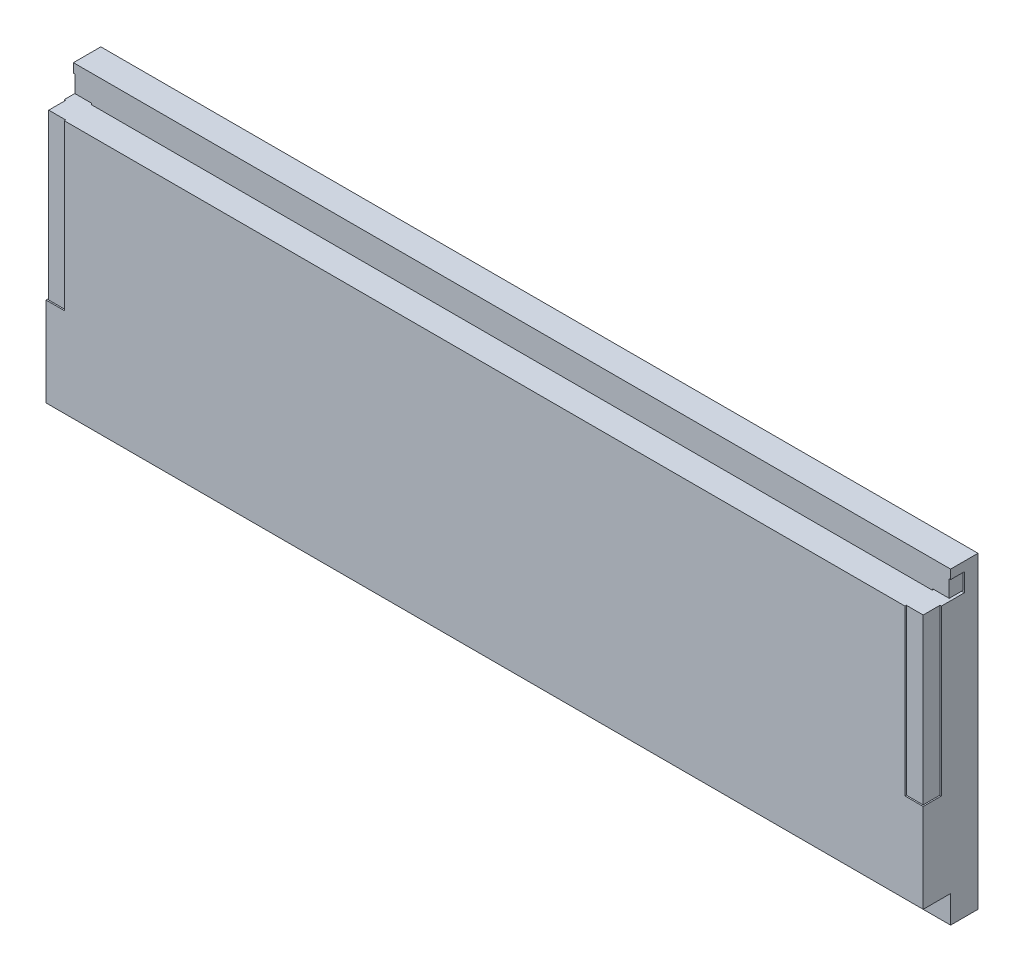
ISO-10303-21;
HEADER;
FILE_DESCRIPTION(('STEP AP214'),'2;1');
FILE_NAME('part.step','',(''),(''),'','','');
FILE_SCHEMA(('AUTOMOTIVE_DESIGN { 1 0 10303 214 1 1 1 1 }'));
ENDSEC;
DATA;
#1=APPLICATION_CONTEXT('core data for automotive mechanical design processes');
#2=APPLICATION_PROTOCOL_DEFINITION('international standard','automotive_design',2000,#1);
#3=PRODUCT_CONTEXT('',#1,'mechanical');
#4=PRODUCT('Part','Part','',(#3));
#5=PRODUCT_RELATED_PRODUCT_CATEGORY('part','',(#4));
#6=PRODUCT_DEFINITION_FORMATION('','',#4);
#7=PRODUCT_DEFINITION_CONTEXT('part definition',#1,'design');
#8=PRODUCT_DEFINITION('design','',#6,#7);
#9=PRODUCT_DEFINITION_SHAPE('','',#8);
#10=(LENGTH_UNIT() NAMED_UNIT(*) SI_UNIT(.MILLI.,.METRE.));
#11=(NAMED_UNIT(*) PLANE_ANGLE_UNIT() SI_UNIT($,.RADIAN.));
#12=(NAMED_UNIT(*) SI_UNIT($,.STERADIAN.) SOLID_ANGLE_UNIT());
#13=UNCERTAINTY_MEASURE_WITH_UNIT(LENGTH_MEASURE(1.E-05),#10,'distance_accuracy_value','');
#14=(GEOMETRIC_REPRESENTATION_CONTEXT(3) GLOBAL_UNCERTAINTY_ASSIGNED_CONTEXT((#13)) GLOBAL_UNIT_ASSIGNED_CONTEXT((#10,
#11,#12)) REPRESENTATION_CONTEXT('',''));
#15=CARTESIAN_POINT('',(0.,0.,0.));
#16=DIRECTION('',(0.,0.,1.));
#17=DIRECTION('',(1.,0.,0.));
#18=AXIS2_PLACEMENT_3D('',#15,#16,#17);
#19=CARTESIAN_POINT('',(960.,337.5,120.));
#20=DIRECTION('',(-1.,0.,0.));
#21=DIRECTION('',(0.,-1.,0.));
#22=AXIS2_PLACEMENT_3D('',#19,#20,#21);
#23=PLANE('',#22);
#24=DIRECTION('',(0.,-1.,0.));
#25=VECTOR('',#24,1.);
#26=CARTESIAN_POINT('',(960.,317.499999999999,30.));
#27=LINE('',#26,#25);
#28=CARTESIAN_POINT('',(960.,317.499999999999,30.));
#29=VERTEX_POINT('',#28);
#30=CARTESIAN_POINT('',(960.,277.499999999999,30.));
#31=VERTEX_POINT('',#30);
#32=EDGE_CURVE('E231',#29,#31,#27,.T.);
#33=ORIENTED_EDGE('',*,*,#32,.T.);
#34=DIRECTION('',(0.,0.,-1.));
#35=VECTOR('',#34,1.);
#36=CARTESIAN_POINT('',(960.,277.5,60.));
#37=LINE('',#36,#35);
#38=CARTESIAN_POINT('',(960.,277.499999999999,80.));
#39=VERTEX_POINT('',#38);
#40=EDGE_CURVE('E425',#39,#31,#37,.T.);
#41=ORIENTED_EDGE('',*,*,#40,.F.);
#42=DIRECTION('',(0.,1.,0.));
#43=VECTOR('',#42,1.);
#44=CARTESIAN_POINT('',(959.999999999999,-82.5000000000005,80.));
#45=LINE('',#44,#43);
#46=CARTESIAN_POINT('',(959.999999999999,-82.5000000000005,80.));
#47=VERTEX_POINT('',#46);
#48=EDGE_CURVE('E280',#47,#39,#45,.T.);
#49=ORIENTED_EDGE('',*,*,#48,.F.);
#50=DIRECTION('',(0.,0.,1.));
#51=VECTOR('',#50,1.);
#52=CARTESIAN_POINT('',(959.999999999999,-82.5000000000005,0.));
#53=LINE('',#52,#51);
#54=CARTESIAN_POINT('',(959.999999999999,-82.5000000000005,120.));
#55=VERTEX_POINT('',#54);
#56=EDGE_CURVE('E260',#47,#55,#53,.T.);
#57=ORIENTED_EDGE('',*,*,#56,.T.);
#58=DIRECTION('',(0.,1.,0.));
#59=VECTOR('',#58,1.);
#60=CARTESIAN_POINT('',(960.,337.5,120.));
#61=LINE('',#60,#59);
#62=CARTESIAN_POINT('',(960.,-277.5,120.));
#63=VERTEX_POINT('',#62);
#64=EDGE_CURVE('E469',#63,#55,#61,.T.);
#65=ORIENTED_EDGE('',*,*,#64,.F.);
#66=DIRECTION('',(0.,0.,1.));
#67=VECTOR('',#66,1.);
#68=CARTESIAN_POINT('',(960.,-277.5,60.));
#69=LINE('',#68,#67);
#70=CARTESIAN_POINT('',(960.,-277.5,60.));
#71=VERTEX_POINT('',#70);
#72=EDGE_CURVE('E448',#71,#63,#69,.T.);
#73=ORIENTED_EDGE('',*,*,#72,.F.);
#74=DIRECTION('',(0.,1.,0.));
#75=VECTOR('',#74,1.);
#76=CARTESIAN_POINT('',(960.,-277.5,60.));
#77=LINE('',#76,#75);
#78=CARTESIAN_POINT('',(960.,-337.5,60.));
#79=VERTEX_POINT('',#78);
#80=EDGE_CURVE('E406',#79,#71,#77,.T.);
#81=ORIENTED_EDGE('',*,*,#80,.F.);
#82=DIRECTION('',(0.,0.,-1.));
#83=VECTOR('',#82,1.);
#84=CARTESIAN_POINT('',(960.,-337.5,120.));
#85=LINE('',#84,#83);
#86=CARTESIAN_POINT('',(960.,-337.5,0.));
#87=VERTEX_POINT('',#86);
#88=EDGE_CURVE('E47',#79,#87,#85,.T.);
#89=ORIENTED_EDGE('',*,*,#88,.T.);
#90=DIRECTION('',(0.,1.,0.));
#91=VECTOR('',#90,1.);
#92=CARTESIAN_POINT('',(960.,337.5,0.));
#93=LINE('',#92,#91);
#94=CARTESIAN_POINT('',(960.,337.5,0.));
#95=VERTEX_POINT('',#94);
#96=EDGE_CURVE('E482',#87,#95,#93,.T.);
#97=ORIENTED_EDGE('',*,*,#96,.T.);
#98=DIRECTION('',(0.,0.,-1.));
#99=VECTOR('',#98,1.);
#100=CARTESIAN_POINT('',(960.,337.5,120.));
#101=LINE('',#100,#99);
#102=CARTESIAN_POINT('',(960.,337.5,60.));
#103=VERTEX_POINT('',#102);
#104=EDGE_CURVE('E491',#103,#95,#101,.T.);
#105=ORIENTED_EDGE('',*,*,#104,.F.);
#106=DIRECTION('',(0.,1.,0.));
#107=VECTOR('',#106,1.);
#108=CARTESIAN_POINT('',(960.,277.5,60.));
#109=LINE('',#108,#107);
#110=CARTESIAN_POINT('',(960.,317.499999999999,60.));
#111=VERTEX_POINT('',#110);
#112=EDGE_CURVE('E245',#111,#103,#109,.T.);
#113=ORIENTED_EDGE('',*,*,#112,.F.);
#114=DIRECTION('',(0.,0.,1.));
#115=VECTOR('',#114,1.);
#116=CARTESIAN_POINT('',(960.,317.499999999999,30.));
#117=LINE('',#116,#115);
#118=EDGE_CURVE('E54',#29,#111,#117,.T.);
#119=ORIENTED_EDGE('',*,*,#118,.F.);
#120=EDGE_LOOP('',(#33,#41,#49,#57,#65,#73,#81,#89,#97,#105,#113,#119));
#121=FACE_BOUND('',#120,.T.);
#122=ADVANCED_FACE('F38',(#121),#23,.F.);
#123=CARTESIAN_POINT('',(-960.,277.499999999999,60.));
#124=DIRECTION('',(0.,0.,-1.));
#125=DIRECTION('',(-1.,0.,0.));
#126=AXIS2_PLACEMENT_3D('',#123,#124,#125);
#127=PLANE('',#126);
#128=DIRECTION('',(0.,1.,0.));
#129=VECTOR('',#128,1.);
#130=CARTESIAN_POINT('',(920.,277.499999999999,60.));
#131=LINE('',#130,#129);
#132=CARTESIAN_POINT('',(920.,277.499999999999,60.));
#133=VERTEX_POINT('',#132);
#134=CARTESIAN_POINT('',(920.,280.499999999999,60.));
#135=VERTEX_POINT('',#134);
#136=EDGE_CURVE('E241',#133,#135,#131,.T.);
#137=ORIENTED_EDGE('',*,*,#136,.T.);
#138=DIRECTION('',(1.,0.,0.));
#139=VECTOR('',#138,1.);
#140=CARTESIAN_POINT('',(957.,280.499999999999,60.));
#141=LINE('',#140,#139);
#142=CARTESIAN_POINT('',(957.,280.499999999999,60.));
#143=VERTEX_POINT('',#142);
#144=EDGE_CURVE('E524',#135,#143,#141,.T.);
#145=ORIENTED_EDGE('',*,*,#144,.T.);
#146=DIRECTION('',(0.,1.,0.));
#147=VECTOR('',#146,1.);
#148=CARTESIAN_POINT('',(957.,280.499999999999,60.));
#149=LINE('',#148,#147);
#150=CARTESIAN_POINT('',(957.,317.499999999999,60.));
#151=VERTEX_POINT('',#150);
#152=EDGE_CURVE('E520',#143,#151,#149,.T.);
#153=ORIENTED_EDGE('',*,*,#152,.T.);
#154=DIRECTION('',(1.,0.,0.));
#155=VECTOR('',#154,1.);
#156=CARTESIAN_POINT('',(960.,317.499999999999,60.));
#157=LINE('',#156,#155);
#158=EDGE_CURVE('E517',#151,#111,#157,.T.);
#159=ORIENTED_EDGE('',*,*,#158,.T.);
#160=ORIENTED_EDGE('',*,*,#112,.T.);
#161=DIRECTION('',(1.,0.,0.));
#162=VECTOR('',#161,1.);
#163=CARTESIAN_POINT('',(-960.,337.499999999999,60.));
#164=LINE('',#163,#162);
#165=CARTESIAN_POINT('',(-960.,337.499999999999,60.));
#166=VERTEX_POINT('',#165);
#167=EDGE_CURVE('E431',#166,#103,#164,.T.);
#168=ORIENTED_EDGE('',*,*,#167,.F.);
#169=DIRECTION('',(0.,1.,0.));
#170=VECTOR('',#169,1.);
#171=CARTESIAN_POINT('',(-960.,277.499999999999,60.));
#172=LINE('',#171,#170);
#173=CARTESIAN_POINT('',(-960.,317.499999999999,60.));
#174=VERTEX_POINT('',#173);
#175=EDGE_CURVE('E421',#174,#166,#172,.T.);
#176=ORIENTED_EDGE('',*,*,#175,.F.);
#177=DIRECTION('',(-1.,0.,0.));
#178=VECTOR('',#177,1.);
#179=CARTESIAN_POINT('',(-960.,317.499999999999,60.));
#180=LINE('',#179,#178);
#181=CARTESIAN_POINT('',(-957.,317.499999999999,60.));
#182=VERTEX_POINT('',#181);
#183=EDGE_CURVE('E316',#182,#174,#180,.T.);
#184=ORIENTED_EDGE('',*,*,#183,.F.);
#185=DIRECTION('',(0.,1.,0.));
#186=VECTOR('',#185,1.);
#187=CARTESIAN_POINT('',(-957.,280.499999999999,60.));
#188=LINE('',#187,#186);
#189=CARTESIAN_POINT('',(-957.,280.499999999999,60.));
#190=VERTEX_POINT('',#189);
#191=EDGE_CURVE('E344',#190,#182,#188,.T.);
#192=ORIENTED_EDGE('',*,*,#191,.F.);
#193=DIRECTION('',(-1.,0.,0.));
#194=VECTOR('',#193,1.);
#195=CARTESIAN_POINT('',(-957.,280.499999999999,60.));
#196=LINE('',#195,#194);
#197=CARTESIAN_POINT('',(-920.,280.499999999999,60.));
#198=VERTEX_POINT('',#197);
#199=EDGE_CURVE('E340',#198,#190,#196,.T.);
#200=ORIENTED_EDGE('',*,*,#199,.F.);
#201=DIRECTION('',(0.,1.,0.));
#202=VECTOR('',#201,1.);
#203=CARTESIAN_POINT('',(-920.,277.499999999999,60.));
#204=LINE('',#203,#202);
#205=CARTESIAN_POINT('',(-920.,277.499999999999,60.));
#206=VERTEX_POINT('',#205);
#207=EDGE_CURVE('E299',#206,#198,#204,.T.);
#208=ORIENTED_EDGE('',*,*,#207,.F.);
#209=DIRECTION('',(1.,0.,0.));
#210=VECTOR('',#209,1.);
#211=CARTESIAN_POINT('',(-960.,277.499999999999,60.));
#212=LINE('',#211,#210);
#213=EDGE_CURVE('E436',#206,#133,#212,.T.);
#214=ORIENTED_EDGE('',*,*,#213,.T.);
#215=EDGE_LOOP('',(#137,#145,#153,#159,#160,#168,#176,#184,#192,#200,#208,#214));
#216=FACE_BOUND('',#215,.T.);
#217=ADVANCED_FACE('F514',(#216),#127,.F.);
#218=CARTESIAN_POINT('',(-960.,277.499999999999,60.));
#219=DIRECTION('',(0.,-1.,0.));
#220=DIRECTION('',(1.,0.,0.));
#221=AXIS2_PLACEMENT_3D('',#218,#219,#220);
#222=PLANE('',#221);
#223=DIRECTION('',(0.,0.,-1.));
#224=VECTOR('',#223,1.);
#225=CARTESIAN_POINT('',(919.999999999999,277.499999999999,0.));
#226=LINE('',#225,#224);
#227=CARTESIAN_POINT('',(919.999999999999,277.499999999999,120.));
#228=VERTEX_POINT('',#227);
#229=CARTESIAN_POINT('',(919.999999999999,277.499999999999,117.));
#230=VERTEX_POINT('',#229);
#231=EDGE_CURVE('E261',#228,#230,#226,.T.);
#232=ORIENTED_EDGE('',*,*,#231,.T.);
#233=DIRECTION('',(-1.,0.,0.));
#234=VECTOR('',#233,1.);
#235=CARTESIAN_POINT('',(0.,277.5,117.));
#236=LINE('',#235,#234);
#237=CARTESIAN_POINT('',(957.,277.499999999999,117.));
#238=VERTEX_POINT('',#237);
#239=EDGE_CURVE('E290',#238,#230,#236,.T.);
#240=ORIENTED_EDGE('',*,*,#239,.F.);
#241=DIRECTION('',(0.,0.,1.));
#242=VECTOR('',#241,1.);
#243=CARTESIAN_POINT('',(957.000000000001,277.499999999999,8.61473055053737E-12));
#244=LINE('',#243,#242);
#245=CARTESIAN_POINT('',(957.,277.499999999999,80.));
#246=VERTEX_POINT('',#245);
#247=EDGE_CURVE('E285',#246,#238,#244,.T.);
#248=ORIENTED_EDGE('',*,*,#247,.F.);
#249=DIRECTION('',(-1.,0.,0.));
#250=VECTOR('',#249,1.);
#251=CARTESIAN_POINT('',(0.,277.5,80.));
#252=LINE('',#251,#250);
#253=EDGE_CURVE('E281',#39,#246,#252,.T.);
#254=ORIENTED_EDGE('',*,*,#253,.F.);
#255=ORIENTED_EDGE('',*,*,#40,.T.);
#256=DIRECTION('',(-1.,0.,0.));
#257=VECTOR('',#256,1.);
#258=CARTESIAN_POINT('',(920.,277.499999999999,30.));
#259=LINE('',#258,#257);
#260=CARTESIAN_POINT('',(920.,277.499999999999,30.));
#261=VERTEX_POINT('',#260);
#262=EDGE_CURVE('E237',#31,#261,#259,.T.);
#263=ORIENTED_EDGE('',*,*,#262,.T.);
#264=DIRECTION('',(0.,0.,1.));
#265=VECTOR('',#264,1.);
#266=CARTESIAN_POINT('',(920.,277.499999999999,30.));
#267=LINE('',#266,#265);
#268=EDGE_CURVE('E286',#261,#133,#267,.T.);
#269=ORIENTED_EDGE('',*,*,#268,.T.);
#270=ORIENTED_EDGE('',*,*,#213,.F.);
#271=DIRECTION('',(0.,0.,1.));
#272=VECTOR('',#271,1.);
#273=CARTESIAN_POINT('',(-920.,277.499999999999,30.));
#274=LINE('',#273,#272);
#275=CARTESIAN_POINT('',(-920.,277.499999999999,30.));
#276=VERTEX_POINT('',#275);
#277=EDGE_CURVE('E336',#276,#206,#274,.T.);
#278=ORIENTED_EDGE('',*,*,#277,.F.);
#279=DIRECTION('',(1.,0.,0.));
#280=VECTOR('',#279,1.);
#281=CARTESIAN_POINT('',(-920.,277.499999999999,30.));
#282=LINE('',#281,#280);
#283=CARTESIAN_POINT('',(-960.,277.499999999999,30.));
#284=VERTEX_POINT('',#283);
#285=EDGE_CURVE('E315',#284,#276,#282,.T.);
#286=ORIENTED_EDGE('',*,*,#285,.F.);
#287=DIRECTION('',(0.,0.,-1.));
#288=VECTOR('',#287,1.);
#289=CARTESIAN_POINT('',(-960.,277.499999999999,60.));
#290=LINE('',#289,#288);
#291=CARTESIAN_POINT('',(-960.,277.499999999999,80.));
#292=VERTEX_POINT('',#291);
#293=EDGE_CURVE('E418',#292,#284,#290,.T.);
#294=ORIENTED_EDGE('',*,*,#293,.F.);
#295=DIRECTION('',(1.,0.,0.));
#296=VECTOR('',#295,1.);
#297=CARTESIAN_POINT('',(0.,277.5,80.));
#298=LINE('',#297,#296);
#299=CARTESIAN_POINT('',(-957.,277.499999999999,80.));
#300=VERTEX_POINT('',#299);
#301=EDGE_CURVE('E371',#292,#300,#298,.T.);
#302=ORIENTED_EDGE('',*,*,#301,.T.);
#303=DIRECTION('',(0.,0.,1.));
#304=VECTOR('',#303,1.);
#305=CARTESIAN_POINT('',(-957.000000000001,277.499999999999,8.61473055053737E-12));
#306=LINE('',#305,#304);
#307=CARTESIAN_POINT('',(-957.,277.499999999999,117.));
#308=VERTEX_POINT('',#307);
#309=EDGE_CURVE('E395',#300,#308,#306,.T.);
#310=ORIENTED_EDGE('',*,*,#309,.T.);
#311=DIRECTION('',(1.,0.,0.));
#312=VECTOR('',#311,1.);
#313=CARTESIAN_POINT('',(0.,277.5,117.));
#314=LINE('',#313,#312);
#315=CARTESIAN_POINT('',(-919.999999999999,277.499999999999,117.));
#316=VERTEX_POINT('',#315);
#317=EDGE_CURVE('E391',#308,#316,#314,.T.);
#318=ORIENTED_EDGE('',*,*,#317,.T.);
#319=DIRECTION('',(0.,0.,-1.));
#320=VECTOR('',#319,1.);
#321=CARTESIAN_POINT('',(-919.999999999999,277.499999999999,0.));
#322=LINE('',#321,#320);
#323=CARTESIAN_POINT('',(-919.999999999999,277.499999999999,120.));
#324=VERTEX_POINT('',#323);
#325=EDGE_CURVE('E354',#324,#316,#322,.T.);
#326=ORIENTED_EDGE('',*,*,#325,.F.);
#327=DIRECTION('',(1.,0.,0.));
#328=VECTOR('',#327,1.);
#329=CARTESIAN_POINT('',(-960.,277.499999999999,120.));
#330=LINE('',#329,#328);
#331=EDGE_CURVE('E424',#324,#228,#330,.T.);
#332=ORIENTED_EDGE('',*,*,#331,.T.);
#333=EDGE_LOOP('',(#232,#240,#248,#254,#255,#263,#269,#270,#278,#286,#294,#302,#310,#318,#326,#332));
#334=FACE_BOUND('',#333,.T.);
#335=ADVANCED_FACE('F558',(#334),#222,.F.);
#336=CARTESIAN_POINT('',(0.,0.,120.));
#337=DIRECTION('',(0.,0.,-1.));
#338=DIRECTION('',(-1.,0.,0.));
#339=AXIS2_PLACEMENT_3D('',#336,#337,#338);
#340=PLANE('',#339);
#341=DIRECTION('',(0.,1.,0.));
#342=VECTOR('',#341,1.);
#343=CARTESIAN_POINT('',(919.999999999999,-82.5000000000005,120.));
#344=LINE('',#343,#342);
#345=CARTESIAN_POINT('',(919.999999999999,-82.5000000000005,120.));
#346=VERTEX_POINT('',#345);
#347=EDGE_CURVE('E62',#346,#228,#344,.T.);
#348=ORIENTED_EDGE('',*,*,#347,.T.);
#349=ORIENTED_EDGE('',*,*,#331,.F.);
#350=DIRECTION('',(0.,1.,0.));
#351=VECTOR('',#350,1.);
#352=CARTESIAN_POINT('',(-919.999999999999,-82.5000000000005,120.));
#353=LINE('',#352,#351);
#354=CARTESIAN_POINT('',(-919.999999999999,-82.5000000000005,120.));
#355=VERTEX_POINT('',#354);
#356=EDGE_CURVE('E387',#355,#324,#353,.T.);
#357=ORIENTED_EDGE('',*,*,#356,.F.);
#358=DIRECTION('',(1.,0.,0.));
#359=VECTOR('',#358,1.);
#360=CARTESIAN_POINT('',(1.14972368299125E-12,-82.5000000000002,119.999999999991));
#361=LINE('',#360,#359);
#362=CARTESIAN_POINT('',(-959.999999999999,-82.5000000000005,120.));
#363=VERTEX_POINT('',#362);
#364=EDGE_CURVE('E366',#363,#355,#361,.T.);
#365=ORIENTED_EDGE('',*,*,#364,.F.);
#366=DIRECTION('',(0.,-1.,0.));
#367=VECTOR('',#366,1.);
#368=CARTESIAN_POINT('',(-960.,337.5,120.));
#369=LINE('',#368,#367);
#370=CARTESIAN_POINT('',(-960.,-277.500000000001,120.));
#371=VERTEX_POINT('',#370);
#372=EDGE_CURVE('E466',#363,#371,#369,.T.);
#373=ORIENTED_EDGE('',*,*,#372,.T.);
#374=DIRECTION('',(1.,0.,0.));
#375=VECTOR('',#374,1.);
#376=CARTESIAN_POINT('',(-960.,-277.500000000001,120.));
#377=LINE('',#376,#375);
#378=EDGE_CURVE('E428',#371,#63,#377,.T.);
#379=ORIENTED_EDGE('',*,*,#378,.T.);
#380=ORIENTED_EDGE('',*,*,#64,.T.);
#381=DIRECTION('',(-1.,0.,0.));
#382=VECTOR('',#381,1.);
#383=CARTESIAN_POINT('',(-1.14972368299125E-12,-82.5000000000002,119.999999999991));
#384=LINE('',#383,#382);
#385=EDGE_CURVE('E256',#55,#346,#384,.T.);
#386=ORIENTED_EDGE('',*,*,#385,.T.);
#387=EDGE_LOOP('',(#348,#349,#357,#365,#373,#379,#380,#386));
#388=FACE_BOUND('',#387,.T.);
#389=ADVANCED_FACE('F570',(#388),#340,.F.);
#390=CARTESIAN_POINT('',(-960.,337.5,120.));
#391=DIRECTION('',(1.,0.,0.));
#392=DIRECTION('',(0.,1.,0.));
#393=AXIS2_PLACEMENT_3D('',#390,#391,#392);
#394=PLANE('',#393);
#395=DIRECTION('',(0.,-1.,0.));
#396=VECTOR('',#395,1.);
#397=CARTESIAN_POINT('',(-960.,317.499999999999,30.));
#398=LINE('',#397,#396);
#399=CARTESIAN_POINT('',(-960.,317.499999999999,30.));
#400=VERTEX_POINT('',#399);
#401=EDGE_CURVE('E311',#400,#284,#398,.T.);
#402=ORIENTED_EDGE('',*,*,#401,.F.);
#403=DIRECTION('',(0.,0.,1.));
#404=VECTOR('',#403,1.);
#405=CARTESIAN_POINT('',(-960.,317.499999999999,30.));
#406=LINE('',#405,#404);
#407=EDGE_CURVE('E350',#400,#174,#406,.T.);
#408=ORIENTED_EDGE('',*,*,#407,.T.);
#409=ORIENTED_EDGE('',*,*,#175,.T.);
#410=DIRECTION('',(0.,0.,-1.));
#411=VECTOR('',#410,1.);
#412=CARTESIAN_POINT('',(-960.,337.5,120.));
#413=LINE('',#412,#411);
#414=CARTESIAN_POINT('',(-960.,337.5,0.));
#415=VERTEX_POINT('',#414);
#416=EDGE_CURVE('E474',#166,#415,#413,.T.);
#417=ORIENTED_EDGE('',*,*,#416,.T.);
#418=DIRECTION('',(0.,-1.,0.));
#419=VECTOR('',#418,1.);
#420=CARTESIAN_POINT('',(-960.,337.5,0.));
#421=LINE('',#420,#419);
#422=CARTESIAN_POINT('',(-960.,-337.5,0.));
#423=VERTEX_POINT('',#422);
#424=EDGE_CURVE('E435',#415,#423,#421,.T.);
#425=ORIENTED_EDGE('',*,*,#424,.T.);
#426=DIRECTION('',(0.,0.,-1.));
#427=VECTOR('',#426,1.);
#428=CARTESIAN_POINT('',(-960.,-337.5,120.));
#429=LINE('',#428,#427);
#430=CARTESIAN_POINT('',(-960.,-337.500000000001,60.));
#431=VERTEX_POINT('',#430);
#432=EDGE_CURVE('E11',#431,#423,#429,.T.);
#433=ORIENTED_EDGE('',*,*,#432,.F.);
#434=DIRECTION('',(0.,1.,0.));
#435=VECTOR('',#434,1.);
#436=CARTESIAN_POINT('',(-960.,-277.500000000001,60.));
#437=LINE('',#436,#435);
#438=CARTESIAN_POINT('',(-960.,-277.500000000001,60.));
#439=VERTEX_POINT('',#438);
#440=EDGE_CURVE('E443',#431,#439,#437,.T.);
#441=ORIENTED_EDGE('',*,*,#440,.T.);
#442=DIRECTION('',(0.,0.,1.));
#443=VECTOR('',#442,1.);
#444=CARTESIAN_POINT('',(-960.,-277.500000000001,60.));
#445=LINE('',#444,#443);
#446=EDGE_CURVE('E447',#439,#371,#445,.T.);
#447=ORIENTED_EDGE('',*,*,#446,.T.);
#448=ORIENTED_EDGE('',*,*,#372,.F.);
#449=DIRECTION('',(0.,0.,1.));
#450=VECTOR('',#449,1.);
#451=CARTESIAN_POINT('',(-959.999999999999,-82.5000000000005,0.));
#452=LINE('',#451,#450);
#453=CARTESIAN_POINT('',(-959.999999999999,-82.5000000000005,80.));
#454=VERTEX_POINT('',#453);
#455=EDGE_CURVE('E384',#454,#363,#452,.T.);
#456=ORIENTED_EDGE('',*,*,#455,.F.);
#457=DIRECTION('',(0.,1.,0.));
#458=VECTOR('',#457,1.);
#459=CARTESIAN_POINT('',(-959.999999999999,-82.5000000000005,80.));
#460=LINE('',#459,#458);
#461=EDGE_CURVE('E402',#454,#292,#460,.T.);
#462=ORIENTED_EDGE('',*,*,#461,.T.);
#463=ORIENTED_EDGE('',*,*,#293,.T.);
#464=EDGE_LOOP('',(#402,#408,#409,#417,#425,#433,#441,#447,#448,#456,#462,#463));
#465=FACE_BOUND('',#464,.T.);
#466=ADVANCED_FACE('F40',(#465),#394,.F.);
#467=CARTESIAN_POINT('',(960.,-337.5,120.));
#468=DIRECTION('',(0.,1.,0.));
#469=DIRECTION('',(-1.,0.,0.));
#470=AXIS2_PLACEMENT_3D('',#467,#468,#469);
#471=PLANE('',#470);
#472=ORIENTED_EDGE('',*,*,#88,.F.);
#473=DIRECTION('',(1.,0.,0.));
#474=VECTOR('',#473,1.);
#475=CARTESIAN_POINT('',(-960.,-337.500000000001,60.));
#476=LINE('',#475,#474);
#477=EDGE_CURVE('E452',#431,#79,#476,.T.);
#478=ORIENTED_EDGE('',*,*,#477,.F.);
#479=ORIENTED_EDGE('',*,*,#432,.T.);
#480=DIRECTION('',(1.,0.,0.));
#481=VECTOR('',#480,1.);
#482=CARTESIAN_POINT('',(960.,-337.5,0.));
#483=LINE('',#482,#481);
#484=EDGE_CURVE('E478',#423,#87,#483,.T.);
#485=ORIENTED_EDGE('',*,*,#484,.T.);
#486=EDGE_LOOP('',(#472,#478,#479,#485));
#487=FACE_BOUND('',#486,.T.);
#488=ADVANCED_FACE('F502',(#487),#471,.F.);
#489=CARTESIAN_POINT('',(960.,337.5,120.));
#490=DIRECTION('',(0.,-1.,0.));
#491=DIRECTION('',(1.,0.,0.));
#492=AXIS2_PLACEMENT_3D('',#489,#490,#491);
#493=PLANE('',#492);
#494=ORIENTED_EDGE('',*,*,#416,.F.);
#495=ORIENTED_EDGE('',*,*,#167,.T.);
#496=ORIENTED_EDGE('',*,*,#104,.T.);
#497=DIRECTION('',(-1.,0.,0.));
#498=VECTOR('',#497,1.);
#499=CARTESIAN_POINT('',(960.,337.5,0.));
#500=LINE('',#499,#498);
#501=EDGE_CURVE('E470',#95,#415,#500,.T.);
#502=ORIENTED_EDGE('',*,*,#501,.T.);
#503=EDGE_LOOP('',(#494,#495,#496,#502));
#504=FACE_BOUND('',#503,.T.);
#505=ADVANCED_FACE('F509',(#504),#493,.F.);
#506=CARTESIAN_POINT('',(0.,0.,0.));
#507=DIRECTION('',(0.,0.,-1.));
#508=DIRECTION('',(-1.,0.,0.));
#509=AXIS2_PLACEMENT_3D('',#506,#507,#508);
#510=PLANE('',#509);
#511=ORIENTED_EDGE('',*,*,#424,.F.);
#512=ORIENTED_EDGE('',*,*,#501,.F.);
#513=ORIENTED_EDGE('',*,*,#96,.F.);
#514=ORIENTED_EDGE('',*,*,#484,.F.);
#515=EDGE_LOOP('',(#511,#512,#513,#514));
#516=FACE_BOUND('',#515,.T.);
#517=ADVANCED_FACE('F506',(#516),#510,.T.);
#518=CARTESIAN_POINT('',(-960.,-277.500000000001,60.));
#519=DIRECTION('',(0.,1.,0.));
#520=DIRECTION('',(-1.,0.,0.));
#521=AXIS2_PLACEMENT_3D('',#518,#519,#520);
#522=PLANE('',#521);
#523=ORIENTED_EDGE('',*,*,#72,.T.);
#524=ORIENTED_EDGE('',*,*,#378,.F.);
#525=ORIENTED_EDGE('',*,*,#446,.F.);
#526=DIRECTION('',(1.,0.,0.));
#527=VECTOR('',#526,1.);
#528=CARTESIAN_POINT('',(-960.,-277.500000000001,60.));
#529=LINE('',#528,#527);
#530=EDGE_CURVE('E461',#439,#71,#529,.T.);
#531=ORIENTED_EDGE('',*,*,#530,.T.);
#532=EDGE_LOOP('',(#523,#524,#525,#531));
#533=FACE_BOUND('',#532,.T.);
#534=ADVANCED_FACE('F574',(#533),#522,.F.);
#535=CARTESIAN_POINT('',(-960.,-277.500000000001,60.));
#536=DIRECTION('',(0.,0.,-1.));
#537=DIRECTION('',(-1.,0.,0.));
#538=AXIS2_PLACEMENT_3D('',#535,#536,#537);
#539=PLANE('',#538);
#540=ORIENTED_EDGE('',*,*,#80,.T.);
#541=ORIENTED_EDGE('',*,*,#530,.F.);
#542=ORIENTED_EDGE('',*,*,#440,.F.);
#543=ORIENTED_EDGE('',*,*,#477,.T.);
#544=EDGE_LOOP('',(#540,#541,#542,#543));
#545=FACE_BOUND('',#544,.T.);
#546=ADVANCED_FACE('F577',(#545),#539,.F.);
#547=CARTESIAN_POINT('',(0.,-82.5000000000002,80.));
#548=DIRECTION('',(0.,0.,1.));
#549=DIRECTION('',(1.,0.,0.));
#550=AXIS2_PLACEMENT_3D('',#547,#548,#549);
#551=PLANE('',#550);
#552=ORIENTED_EDGE('',*,*,#301,.F.);
#553=ORIENTED_EDGE('',*,*,#461,.F.);
#554=DIRECTION('',(1.,0.,0.));
#555=VECTOR('',#554,1.);
#556=CARTESIAN_POINT('',(0.,-82.5000000000002,80.));
#557=LINE('',#556,#555);
#558=CARTESIAN_POINT('',(-957.,-82.5000000000005,80.));
#559=VERTEX_POINT('',#558);
#560=EDGE_CURVE('E381',#454,#559,#557,.T.);
#561=ORIENTED_EDGE('',*,*,#560,.T.);
#562=DIRECTION('',(0.,1.,0.));
#563=VECTOR('',#562,1.);
#564=CARTESIAN_POINT('',(-957.,-82.5000000000005,80.));
#565=LINE('',#564,#563);
#566=EDGE_CURVE('E407',#559,#300,#565,.T.);
#567=ORIENTED_EDGE('',*,*,#566,.T.);
#568=EDGE_LOOP('',(#552,#553,#561,#567));
#569=FACE_BOUND('',#568,.T.);
#570=ADVANCED_FACE('F602',(#569),#551,.T.);
#571=CARTESIAN_POINT('',(-957.,-82.5000000000005,8.61473055053737E-12));
#572=DIRECTION('',(-1.,0.,0.));
#573=DIRECTION('',(0.,0.,1.));
#574=AXIS2_PLACEMENT_3D('',#571,#572,#573);
#575=PLANE('',#574);
#576=ORIENTED_EDGE('',*,*,#309,.F.);
#577=ORIENTED_EDGE('',*,*,#566,.F.);
#578=DIRECTION('',(0.,0.,1.));
#579=VECTOR('',#578,1.);
#580=CARTESIAN_POINT('',(-957.,-82.5000000000005,8.61473055053737E-12));
#581=LINE('',#580,#579);
#582=CARTESIAN_POINT('',(-956.999999999999,-82.5000000000005,117.));
#583=VERTEX_POINT('',#582);
#584=EDGE_CURVE('E378',#559,#583,#581,.T.);
#585=ORIENTED_EDGE('',*,*,#584,.T.);
#586=DIRECTION('',(0.,1.,0.));
#587=VECTOR('',#586,1.);
#588=CARTESIAN_POINT('',(-956.999999999999,-82.5000000000005,117.));
#589=LINE('',#588,#587);
#590=EDGE_CURVE('E410',#583,#308,#589,.T.);
#591=ORIENTED_EDGE('',*,*,#590,.T.);
#592=EDGE_LOOP('',(#576,#577,#585,#591));
#593=FACE_BOUND('',#592,.T.);
#594=ADVANCED_FACE('F612',(#593),#575,.T.);
#595=CARTESIAN_POINT('',(0.,-82.5000000000002,117.));
#596=DIRECTION('',(0.,0.,1.));
#597=DIRECTION('',(1.,0.,0.));
#598=AXIS2_PLACEMENT_3D('',#595,#596,#597);
#599=PLANE('',#598);
#600=ORIENTED_EDGE('',*,*,#317,.F.);
#601=ORIENTED_EDGE('',*,*,#590,.F.);
#602=DIRECTION('',(1.,0.,0.));
#603=VECTOR('',#602,1.);
#604=CARTESIAN_POINT('',(0.,-82.5000000000002,117.));
#605=LINE('',#604,#603);
#606=CARTESIAN_POINT('',(-919.999999999999,-82.5000000000005,117.));
#607=VERTEX_POINT('',#606);
#608=EDGE_CURVE('E375',#583,#607,#605,.T.);
#609=ORIENTED_EDGE('',*,*,#608,.T.);
#610=DIRECTION('',(0.,1.,0.));
#611=VECTOR('',#610,1.);
#612=CARTESIAN_POINT('',(-919.999999999999,-82.5000000000005,117.));
#613=LINE('',#612,#611);
#614=EDGE_CURVE('E413',#607,#316,#613,.T.);
#615=ORIENTED_EDGE('',*,*,#614,.T.);
#616=EDGE_LOOP('',(#600,#601,#609,#615));
#617=FACE_BOUND('',#616,.T.);
#618=ADVANCED_FACE('F615',(#617),#599,.T.);
#619=CARTESIAN_POINT('',(-919.999999999999,-82.5000000000005,0.));
#620=DIRECTION('',(1.,0.,0.));
#621=DIRECTION('',(0.,1.,0.));
#622=AXIS2_PLACEMENT_3D('',#619,#620,#621);
#623=PLANE('',#622);
#624=ORIENTED_EDGE('',*,*,#325,.T.);
#625=ORIENTED_EDGE('',*,*,#614,.F.);
#626=DIRECTION('',(0.,0.,-1.));
#627=VECTOR('',#626,1.);
#628=CARTESIAN_POINT('',(-919.999999999999,-82.5000000000005,0.));
#629=LINE('',#628,#627);
#630=EDGE_CURVE('E370',#355,#607,#629,.T.);
#631=ORIENTED_EDGE('',*,*,#630,.F.);
#632=ORIENTED_EDGE('',*,*,#356,.T.);
#633=EDGE_LOOP('',(#624,#625,#631,#632));
#634=FACE_BOUND('',#633,.T.);
#635=ADVANCED_FACE('F620',(#634),#623,.F.);
#636=CARTESIAN_POINT('',(0.,-82.5000000000002,0.));
#637=DIRECTION('',(0.,1.,0.));
#638=DIRECTION('',(-1.,0.,0.));
#639=AXIS2_PLACEMENT_3D('',#636,#637,#638);
#640=PLANE('',#639);
#641=ORIENTED_EDGE('',*,*,#364,.T.);
#642=ORIENTED_EDGE('',*,*,#630,.T.);
#643=ORIENTED_EDGE('',*,*,#608,.F.);
#644=ORIENTED_EDGE('',*,*,#584,.F.);
#645=ORIENTED_EDGE('',*,*,#560,.F.);
#646=ORIENTED_EDGE('',*,*,#455,.T.);
#647=EDGE_LOOP('',(#641,#642,#643,#644,#645,#646));
#648=FACE_BOUND('',#647,.T.);
#649=ADVANCED_FACE('F606',(#648),#640,.T.);
#650=CARTESIAN_POINT('',(-960.,317.499999999999,30.));
#651=DIRECTION('',(0.,1.,0.));
#652=DIRECTION('',(0.,0.,1.));
#653=AXIS2_PLACEMENT_3D('',#650,#651,#652);
#654=PLANE('',#653);
#655=ORIENTED_EDGE('',*,*,#183,.T.);
#656=ORIENTED_EDGE('',*,*,#407,.F.);
#657=DIRECTION('',(-1.,0.,0.));
#658=VECTOR('',#657,1.);
#659=CARTESIAN_POINT('',(-960.,317.499999999999,30.));
#660=LINE('',#659,#658);
#661=CARTESIAN_POINT('',(-957.,317.499999999999,30.));
#662=VERTEX_POINT('',#661);
#663=EDGE_CURVE('E332',#662,#400,#660,.T.);
#664=ORIENTED_EDGE('',*,*,#663,.F.);
#665=DIRECTION('',(0.,0.,1.));
#666=VECTOR('',#665,1.);
#667=CARTESIAN_POINT('',(-957.,317.499999999999,30.));
#668=LINE('',#667,#666);
#669=EDGE_CURVE('E355',#662,#182,#668,.T.);
#670=ORIENTED_EDGE('',*,*,#669,.T.);
#671=EDGE_LOOP('',(#655,#656,#664,#670));
#672=FACE_BOUND('',#671,.T.);
#673=ADVANCED_FACE('F582',(#672),#654,.F.);
#674=CARTESIAN_POINT('',(-957.,280.499999999999,30.));
#675=DIRECTION('',(1.,0.,0.));
#676=DIRECTION('',(0.,0.,-1.));
#677=AXIS2_PLACEMENT_3D('',#674,#675,#676);
#678=PLANE('',#677);
#679=ORIENTED_EDGE('',*,*,#191,.T.);
#680=ORIENTED_EDGE('',*,*,#669,.F.);
#681=DIRECTION('',(0.,1.,0.));
#682=VECTOR('',#681,1.);
#683=CARTESIAN_POINT('',(-957.,280.499999999999,30.));
#684=LINE('',#683,#682);
#685=CARTESIAN_POINT('',(-957.,280.499999999999,30.));
#686=VERTEX_POINT('',#685);
#687=EDGE_CURVE('E328',#686,#662,#684,.T.);
#688=ORIENTED_EDGE('',*,*,#687,.F.);
#689=DIRECTION('',(0.,0.,1.));
#690=VECTOR('',#689,1.);
#691=CARTESIAN_POINT('',(-957.,280.499999999999,30.));
#692=LINE('',#691,#690);
#693=EDGE_CURVE('E358',#686,#190,#692,.T.);
#694=ORIENTED_EDGE('',*,*,#693,.T.);
#695=EDGE_LOOP('',(#679,#680,#688,#694));
#696=FACE_BOUND('',#695,.T.);
#697=ADVANCED_FACE('F588',(#696),#678,.F.);
#698=CARTESIAN_POINT('',(-957.,280.499999999999,30.));
#699=DIRECTION('',(0.,1.,0.));
#700=DIRECTION('',(0.,0.,1.));
#701=AXIS2_PLACEMENT_3D('',#698,#699,#700);
#702=PLANE('',#701);
#703=ORIENTED_EDGE('',*,*,#199,.T.);
#704=ORIENTED_EDGE('',*,*,#693,.F.);
#705=DIRECTION('',(-1.,0.,0.));
#706=VECTOR('',#705,1.);
#707=CARTESIAN_POINT('',(-957.,280.499999999999,30.));
#708=LINE('',#707,#706);
#709=CARTESIAN_POINT('',(-920.,280.499999999999,30.));
#710=VERTEX_POINT('',#709);
#711=EDGE_CURVE('E324',#710,#686,#708,.T.);
#712=ORIENTED_EDGE('',*,*,#711,.F.);
#713=DIRECTION('',(0.,0.,1.));
#714=VECTOR('',#713,1.);
#715=CARTESIAN_POINT('',(-920.,280.499999999999,30.));
#716=LINE('',#715,#714);
#717=EDGE_CURVE('E361',#710,#198,#716,.T.);
#718=ORIENTED_EDGE('',*,*,#717,.T.);
#719=EDGE_LOOP('',(#703,#704,#712,#718));
#720=FACE_BOUND('',#719,.T.);
#721=ADVANCED_FACE('F592',(#720),#702,.F.);
#722=CARTESIAN_POINT('',(-920.,277.499999999999,30.));
#723=DIRECTION('',(1.,0.,0.));
#724=DIRECTION('',(0.,0.,-1.));
#725=AXIS2_PLACEMENT_3D('',#722,#723,#724);
#726=PLANE('',#725);
#727=ORIENTED_EDGE('',*,*,#207,.T.);
#728=ORIENTED_EDGE('',*,*,#717,.F.);
#729=DIRECTION('',(0.,1.,0.));
#730=VECTOR('',#729,1.);
#731=CARTESIAN_POINT('',(-920.,277.499999999999,30.));
#732=LINE('',#731,#730);
#733=EDGE_CURVE('E320',#276,#710,#732,.T.);
#734=ORIENTED_EDGE('',*,*,#733,.F.);
#735=ORIENTED_EDGE('',*,*,#277,.T.);
#736=EDGE_LOOP('',(#727,#728,#734,#735));
#737=FACE_BOUND('',#736,.T.);
#738=ADVANCED_FACE('F595',(#737),#726,.F.);
#739=CARTESIAN_POINT('',(0.,0.,30.));
#740=DIRECTION('',(0.,0.,-1.));
#741=DIRECTION('',(-1.,0.,0.));
#742=AXIS2_PLACEMENT_3D('',#739,#740,#741);
#743=PLANE('',#742);
#744=ORIENTED_EDGE('',*,*,#401,.T.);
#745=ORIENTED_EDGE('',*,*,#285,.T.);
#746=ORIENTED_EDGE('',*,*,#733,.T.);
#747=ORIENTED_EDGE('',*,*,#711,.T.);
#748=ORIENTED_EDGE('',*,*,#687,.T.);
#749=ORIENTED_EDGE('',*,*,#663,.T.);
#750=EDGE_LOOP('',(#744,#745,#746,#747,#748,#749));
#751=FACE_BOUND('',#750,.T.);
#752=ADVANCED_FACE('F584',(#751),#743,.F.);
#753=CARTESIAN_POINT('',(919.999999999999,-82.5000000000005,0.));
#754=DIRECTION('',(1.,0.,0.));
#755=DIRECTION('',(0.,1.,0.));
#756=AXIS2_PLACEMENT_3D('',#753,#754,#755);
#757=PLANE('',#756);
#758=ORIENTED_EDGE('',*,*,#231,.F.);
#759=ORIENTED_EDGE('',*,*,#347,.F.);
#760=DIRECTION('',(0.,0.,-1.));
#761=VECTOR('',#760,1.);
#762=CARTESIAN_POINT('',(919.999999999999,-82.5000000000005,0.));
#763=LINE('',#762,#761);
#764=CARTESIAN_POINT('',(919.999999999999,-82.5000000000005,117.));
#765=VERTEX_POINT('',#764);
#766=EDGE_CURVE('E277',#346,#765,#763,.T.);
#767=ORIENTED_EDGE('',*,*,#766,.T.);
#768=DIRECTION('',(0.,1.,0.));
#769=VECTOR('',#768,1.);
#770=CARTESIAN_POINT('',(919.999999999999,-82.5000000000005,117.));
#771=LINE('',#770,#769);
#772=EDGE_CURVE('E300',#765,#230,#771,.T.);
#773=ORIENTED_EDGE('',*,*,#772,.T.);
#774=EDGE_LOOP('',(#758,#759,#767,#773));
#775=FACE_BOUND('',#774,.T.);
#776=ADVANCED_FACE('F684',(#775),#757,.T.);
#777=CARTESIAN_POINT('',(0.,-82.5000000000002,117.));
#778=DIRECTION('',(0.,0.,-1.));
#779=DIRECTION('',(-1.,0.,0.));
#780=AXIS2_PLACEMENT_3D('',#777,#778,#779);
#781=PLANE('',#780);
#782=ORIENTED_EDGE('',*,*,#239,.T.);
#783=ORIENTED_EDGE('',*,*,#772,.F.);
#784=DIRECTION('',(-1.,0.,0.));
#785=VECTOR('',#784,1.);
#786=CARTESIAN_POINT('',(0.,-82.5000000000002,117.));
#787=LINE('',#786,#785);
#788=CARTESIAN_POINT('',(956.999999999999,-82.5000000000005,117.));
#789=VERTEX_POINT('',#788);
#790=EDGE_CURVE('E273',#789,#765,#787,.T.);
#791=ORIENTED_EDGE('',*,*,#790,.F.);
#792=DIRECTION('',(0.,1.,0.));
#793=VECTOR('',#792,1.);
#794=CARTESIAN_POINT('',(956.999999999999,-82.5000000000005,117.));
#795=LINE('',#794,#793);
#796=EDGE_CURVE('E303',#789,#238,#795,.T.);
#797=ORIENTED_EDGE('',*,*,#796,.T.);
#798=EDGE_LOOP('',(#782,#783,#791,#797));
#799=FACE_BOUND('',#798,.T.);
#800=ADVANCED_FACE('F690',(#799),#781,.F.);
#801=CARTESIAN_POINT('',(957.,-82.5000000000005,8.61473055053737E-12));
#802=DIRECTION('',(-1.,0.,0.));
#803=DIRECTION('',(0.,0.,1.));
#804=AXIS2_PLACEMENT_3D('',#801,#802,#803);
#805=PLANE('',#804);
#806=ORIENTED_EDGE('',*,*,#247,.T.);
#807=ORIENTED_EDGE('',*,*,#796,.F.);
#808=DIRECTION('',(0.,0.,1.));
#809=VECTOR('',#808,1.);
#810=CARTESIAN_POINT('',(957.,-82.5000000000005,8.61473055053737E-12));
#811=LINE('',#810,#809);
#812=CARTESIAN_POINT('',(957.,-82.5000000000005,80.));
#813=VERTEX_POINT('',#812);
#814=EDGE_CURVE('E269',#813,#789,#811,.T.);
#815=ORIENTED_EDGE('',*,*,#814,.F.);
#816=DIRECTION('',(0.,1.,0.));
#817=VECTOR('',#816,1.);
#818=CARTESIAN_POINT('',(957.,-82.5000000000005,80.));
#819=LINE('',#818,#817);
#820=EDGE_CURVE('E306',#813,#246,#819,.T.);
#821=ORIENTED_EDGE('',*,*,#820,.T.);
#822=EDGE_LOOP('',(#806,#807,#815,#821));
#823=FACE_BOUND('',#822,.T.);
#824=ADVANCED_FACE('F687',(#823),#805,.F.);
#825=CARTESIAN_POINT('',(0.,-82.5000000000002,80.));
#826=DIRECTION('',(0.,0.,-1.));
#827=DIRECTION('',(-1.,0.,0.));
#828=AXIS2_PLACEMENT_3D('',#825,#826,#827);
#829=PLANE('',#828);
#830=ORIENTED_EDGE('',*,*,#253,.T.);
#831=ORIENTED_EDGE('',*,*,#820,.F.);
#832=DIRECTION('',(-1.,0.,0.));
#833=VECTOR('',#832,1.);
#834=CARTESIAN_POINT('',(0.,-82.5000000000002,80.));
#835=LINE('',#834,#833);
#836=EDGE_CURVE('E265',#47,#813,#835,.T.);
#837=ORIENTED_EDGE('',*,*,#836,.F.);
#838=ORIENTED_EDGE('',*,*,#48,.T.);
#839=EDGE_LOOP('',(#830,#831,#837,#838));
#840=FACE_BOUND('',#839,.T.);
#841=ADVANCED_FACE('F565',(#840),#829,.F.);
#842=CARTESIAN_POINT('',(0.,-82.5000000000002,0.));
#843=DIRECTION('',(0.,1.,0.));
#844=DIRECTION('',(1.,0.,0.));
#845=AXIS2_PLACEMENT_3D('',#842,#843,#844);
#846=PLANE('',#845);
#847=ORIENTED_EDGE('',*,*,#385,.F.);
#848=ORIENTED_EDGE('',*,*,#56,.F.);
#849=ORIENTED_EDGE('',*,*,#836,.T.);
#850=ORIENTED_EDGE('',*,*,#814,.T.);
#851=ORIENTED_EDGE('',*,*,#790,.T.);
#852=ORIENTED_EDGE('',*,*,#766,.F.);
#853=EDGE_LOOP('',(#847,#848,#849,#850,#851,#852));
#854=FACE_BOUND('',#853,.T.);
#855=ADVANCED_FACE('F568',(#854),#846,.T.);
#856=CARTESIAN_POINT('',(920.,277.499999999999,30.));
#857=DIRECTION('',(1.,0.,0.));
#858=DIRECTION('',(0.,0.,-1.));
#859=AXIS2_PLACEMENT_3D('',#856,#857,#858);
#860=PLANE('',#859);
#861=ORIENTED_EDGE('',*,*,#136,.F.);
#862=ORIENTED_EDGE('',*,*,#268,.F.);
#863=DIRECTION('',(0.,1.,0.));
#864=VECTOR('',#863,1.);
#865=CARTESIAN_POINT('',(920.,277.499999999999,30.));
#866=LINE('',#865,#864);
#867=CARTESIAN_POINT('',(920.,280.499999999999,30.));
#868=VERTEX_POINT('',#867);
#869=EDGE_CURVE('E252',#261,#868,#866,.T.);
#870=ORIENTED_EDGE('',*,*,#869,.T.);
#871=DIRECTION('',(0.,0.,1.));
#872=VECTOR('',#871,1.);
#873=CARTESIAN_POINT('',(920.,280.499999999999,30.));
#874=LINE('',#873,#872);
#875=EDGE_CURVE('E534',#868,#135,#874,.T.);
#876=ORIENTED_EDGE('',*,*,#875,.T.);
#877=EDGE_LOOP('',(#861,#862,#870,#876));
#878=FACE_BOUND('',#877,.T.);
#879=ADVANCED_FACE('F551',(#878),#860,.T.);
#880=CARTESIAN_POINT('',(957.,280.499999999999,30.));
#881=DIRECTION('',(0.,-1.,0.));
#882=DIRECTION('',(0.,0.,-1.));
#883=AXIS2_PLACEMENT_3D('',#880,#881,#882);
#884=PLANE('',#883);
#885=ORIENTED_EDGE('',*,*,#144,.F.);
#886=ORIENTED_EDGE('',*,*,#875,.F.);
#887=DIRECTION('',(1.,0.,0.));
#888=VECTOR('',#887,1.);
#889=CARTESIAN_POINT('',(957.,280.499999999999,30.));
#890=LINE('',#889,#888);
#891=CARTESIAN_POINT('',(957.,280.499999999999,30.));
#892=VERTEX_POINT('',#891);
#893=EDGE_CURVE('E543',#868,#892,#890,.T.);
#894=ORIENTED_EDGE('',*,*,#893,.T.);
#895=DIRECTION('',(0.,0.,1.));
#896=VECTOR('',#895,1.);
#897=CARTESIAN_POINT('',(957.,280.499999999999,30.));
#898=LINE('',#897,#896);
#899=EDGE_CURVE('E250',#892,#143,#898,.T.);
#900=ORIENTED_EDGE('',*,*,#899,.T.);
#901=EDGE_LOOP('',(#885,#886,#894,#900));
#902=FACE_BOUND('',#901,.T.);
#903=ADVANCED_FACE('F540',(#902),#884,.T.);
#904=CARTESIAN_POINT('',(957.,280.499999999999,30.));
#905=DIRECTION('',(1.,0.,0.));
#906=DIRECTION('',(0.,0.,-1.));
#907=AXIS2_PLACEMENT_3D('',#904,#905,#906);
#908=PLANE('',#907);
#909=ORIENTED_EDGE('',*,*,#152,.F.);
#910=ORIENTED_EDGE('',*,*,#899,.F.);
#911=DIRECTION('',(0.,1.,0.));
#912=VECTOR('',#911,1.);
#913=CARTESIAN_POINT('',(957.,280.499999999999,30.));
#914=LINE('',#913,#912);
#915=CARTESIAN_POINT('',(957.,317.499999999999,30.));
#916=VERTEX_POINT('',#915);
#917=EDGE_CURVE('E230',#892,#916,#914,.T.);
#918=ORIENTED_EDGE('',*,*,#917,.T.);
#919=DIRECTION('',(0.,0.,1.));
#920=VECTOR('',#919,1.);
#921=CARTESIAN_POINT('',(957.,317.499999999999,30.));
#922=LINE('',#921,#920);
#923=EDGE_CURVE('E226',#916,#151,#922,.T.);
#924=ORIENTED_EDGE('',*,*,#923,.T.);
#925=EDGE_LOOP('',(#909,#910,#918,#924));
#926=FACE_BOUND('',#925,.T.);
#927=ADVANCED_FACE('F545',(#926),#908,.T.);
#928=CARTESIAN_POINT('',(960.,317.499999999999,30.));
#929=DIRECTION('',(0.,-1.,0.));
#930=DIRECTION('',(0.,0.,-1.));
#931=AXIS2_PLACEMENT_3D('',#928,#929,#930);
#932=PLANE('',#931);
#933=ORIENTED_EDGE('',*,*,#158,.F.);
#934=ORIENTED_EDGE('',*,*,#923,.F.);
#935=DIRECTION('',(1.,0.,0.));
#936=VECTOR('',#935,1.);
#937=CARTESIAN_POINT('',(960.,317.499999999999,30.));
#938=LINE('',#937,#936);
#939=EDGE_CURVE('E223',#916,#29,#938,.T.);
#940=ORIENTED_EDGE('',*,*,#939,.T.);
#941=ORIENTED_EDGE('',*,*,#118,.T.);
#942=EDGE_LOOP('',(#933,#934,#940,#941));
#943=FACE_BOUND('',#942,.T.);
#944=ADVANCED_FACE('F225',(#943),#932,.T.);
#945=CARTESIAN_POINT('',(0.,0.,30.));
#946=DIRECTION('',(0.,0.,-1.));
#947=DIRECTION('',(1.,0.,0.));
#948=AXIS2_PLACEMENT_3D('',#945,#946,#947);
#949=PLANE('',#948);
#950=ORIENTED_EDGE('',*,*,#32,.F.);
#951=ORIENTED_EDGE('',*,*,#939,.F.);
#952=ORIENTED_EDGE('',*,*,#917,.F.);
#953=ORIENTED_EDGE('',*,*,#893,.F.);
#954=ORIENTED_EDGE('',*,*,#869,.F.);
#955=ORIENTED_EDGE('',*,*,#262,.F.);
#956=EDGE_LOOP('',(#950,#951,#952,#953,#954,#955));
#957=FACE_BOUND('',#956,.T.);
#958=ADVANCED_FACE('F235',(#957),#949,.F.);
#959=CLOSED_SHELL('',(#122,#217,#335,#389,#466,#488,#505,#517,#534,#546,#570,#594,#618,#635,
#649,#673,#697,#721,#738,#752,#776,#800,#824,#841,#855,#879,#903,#927,#944,#958));
#960=MANIFOLD_SOLID_BREP('B2',#959);
#961=ADVANCED_BREP_SHAPE_REPRESENTATION('',(#18,#960),#14);
#962=SHAPE_DEFINITION_REPRESENTATION(#9,#961);
ENDSEC;
END-ISO-10303-21;
